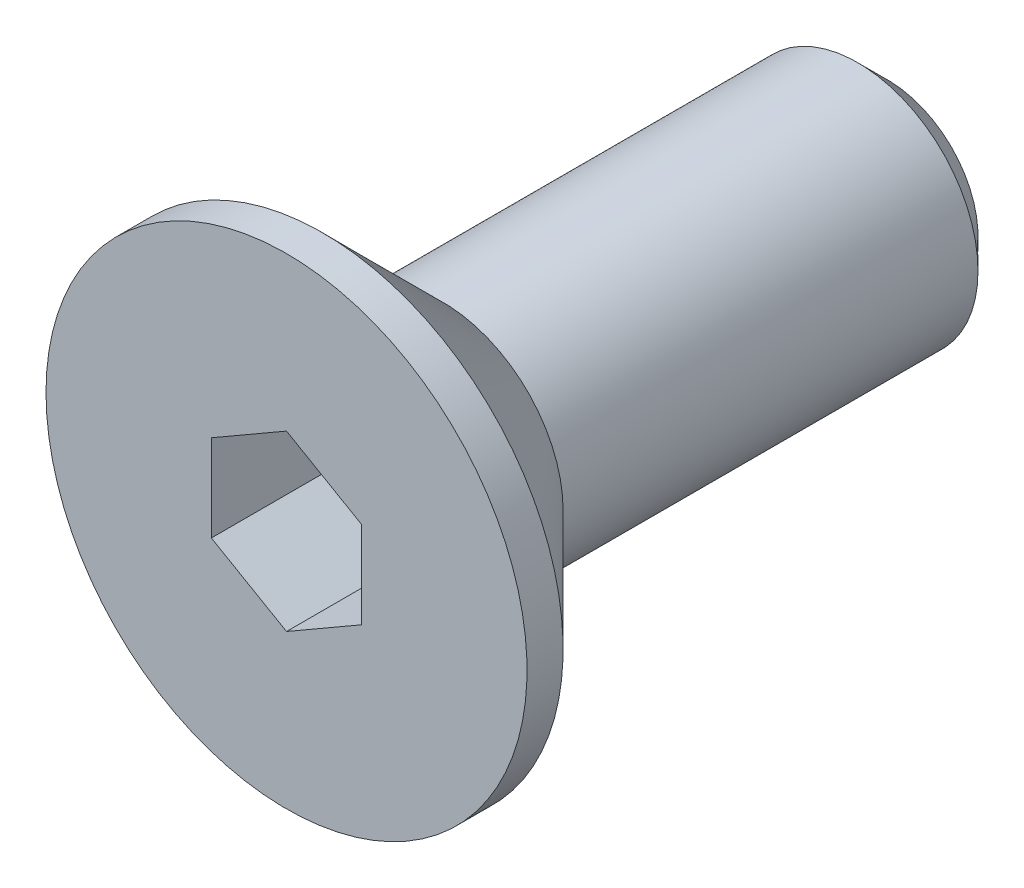
ISO-10303-21;
HEADER;
FILE_DESCRIPTION(('STEP AP214'),'2;1');
FILE_NAME('part.step','',(''),(''),'','','');
FILE_SCHEMA(('AUTOMOTIVE_DESIGN { 1 0 10303 214 1 1 1 1 }'));
ENDSEC;
DATA;
#1=APPLICATION_CONTEXT('core data for automotive mechanical design processes');
#2=APPLICATION_PROTOCOL_DEFINITION('international standard','automotive_design',2000,#1);
#3=PRODUCT_CONTEXT('',#1,'mechanical');
#4=PRODUCT('Part','Part','',(#3));
#5=PRODUCT_RELATED_PRODUCT_CATEGORY('part','',(#4));
#6=PRODUCT_DEFINITION_FORMATION('','',#4);
#7=PRODUCT_DEFINITION_CONTEXT('part definition',#1,'design');
#8=PRODUCT_DEFINITION('design','',#6,#7);
#9=PRODUCT_DEFINITION_SHAPE('','',#8);
#10=(LENGTH_UNIT() NAMED_UNIT(*) SI_UNIT(.MILLI.,.METRE.));
#11=(NAMED_UNIT(*) PLANE_ANGLE_UNIT() SI_UNIT($,.RADIAN.));
#12=(NAMED_UNIT(*) SI_UNIT($,.STERADIAN.) SOLID_ANGLE_UNIT());
#13=UNCERTAINTY_MEASURE_WITH_UNIT(LENGTH_MEASURE(1.E-05),#10,'distance_accuracy_value','');
#14=(GEOMETRIC_REPRESENTATION_CONTEXT(3) GLOBAL_UNCERTAINTY_ASSIGNED_CONTEXT((#13)) GLOBAL_UNIT_ASSIGNED_CONTEXT((#10,
#11,#12)) REPRESENTATION_CONTEXT('',''));
#15=CARTESIAN_POINT('',(0.,0.,0.));
#16=DIRECTION('',(0.,0.,1.));
#17=DIRECTION('',(1.,0.,0.));
#18=AXIS2_PLACEMENT_3D('',#15,#16,#17);
#19=CARTESIAN_POINT('',(0.,0.,5.));
#20=DIRECTION('',(0.,0.,1.));
#21=DIRECTION('',(1.,0.,0.));
#22=AXIS2_PLACEMENT_3D('',#19,#20,#21);
#23=PLANE('',#22);
#24=DIRECTION('',(-0.866025403784439,0.5,0.));
#25=VECTOR('',#24,1.);
#26=CARTESIAN_POINT('',(1.25,0.721687836487034,5.));
#27=LINE('',#26,#25);
#28=CARTESIAN_POINT('',(1.25,0.721687836487034,5.));
#29=VERTEX_POINT('',#28);
#30=CARTESIAN_POINT('',(0.,1.44337567297407,5.));
#31=VERTEX_POINT('',#30);
#32=EDGE_CURVE('E67',#29,#31,#27,.T.);
#33=ORIENTED_EDGE('',*,*,#32,.F.);
#34=DIRECTION('',(0.,1.,0.));
#35=VECTOR('',#34,1.);
#36=CARTESIAN_POINT('',(1.25,-0.721687836487031,5.));
#37=LINE('',#36,#35);
#38=CARTESIAN_POINT('',(1.25,-0.721687836487031,5.));
#39=VERTEX_POINT('',#38);
#40=EDGE_CURVE('E150',#39,#29,#37,.T.);
#41=ORIENTED_EDGE('',*,*,#40,.F.);
#42=DIRECTION('',(0.866025403784439,0.5,0.));
#43=VECTOR('',#42,1.);
#44=CARTESIAN_POINT('',(0.,-1.44337567297406,5.));
#45=LINE('',#44,#43);
#46=CARTESIAN_POINT('',(0.,-1.44337567297406,5.));
#47=VERTEX_POINT('',#46);
#48=EDGE_CURVE('E148',#47,#39,#45,.T.);
#49=ORIENTED_EDGE('',*,*,#48,.F.);
#50=DIRECTION('',(0.866025403784439,-0.5,0.));
#51=VECTOR('',#50,1.);
#52=CARTESIAN_POINT('',(-1.25,-0.721687836487031,5.));
#53=LINE('',#52,#51);
#54=CARTESIAN_POINT('',(-1.25,-0.721687836487031,5.));
#55=VERTEX_POINT('',#54);
#56=EDGE_CURVE('E115',#55,#47,#53,.T.);
#57=ORIENTED_EDGE('',*,*,#56,.F.);
#58=DIRECTION('',(0.,-1.,0.));
#59=VECTOR('',#58,1.);
#60=CARTESIAN_POINT('',(-1.25,0.721687836487034,5.));
#61=LINE('',#60,#59);
#62=CARTESIAN_POINT('',(-1.25,0.721687836487034,5.));
#63=VERTEX_POINT('',#62);
#64=EDGE_CURVE('E144',#63,#55,#61,.T.);
#65=ORIENTED_EDGE('',*,*,#64,.F.);
#66=DIRECTION('',(-0.866025403784439,-0.5,0.));
#67=VECTOR('',#66,1.);
#68=CARTESIAN_POINT('',(0.,1.44337567297407,5.));
#69=LINE('',#68,#67);
#70=EDGE_CURVE('E141',#31,#63,#69,.T.);
#71=ORIENTED_EDGE('',*,*,#70,.F.);
#72=EDGE_LOOP('',(#33,#41,#49,#57,#65,#71));
#73=FACE_BOUND('',#72,.T.);
#74=CARTESIAN_POINT('',(0.,0.,5.));
#75=DIRECTION('',(0.,0.,-1.));
#76=DIRECTION('',(-1.,0.,0.));
#77=AXIS2_PLACEMENT_3D('',#74,#75,#76);
#78=CIRCLE('',#77,4.);
#79=CARTESIAN_POINT('',(-4.,0.,5.));
#80=VERTEX_POINT('',#79);
#81=EDGE_CURVE('E165',#80,#80,#78,.T.);
#82=ORIENTED_EDGE('',*,*,#81,.F.);
#83=EDGE_LOOP('',(#82));
#84=FACE_BOUND('',#83,.T.);
#85=ADVANCED_FACE('F51',(#73,#84),#23,.T.);
#86=CARTESIAN_POINT('',(0.,0.,-5.));
#87=DIRECTION('',(0.,0.,-1.));
#88=DIRECTION('',(-1.,0.,0.));
#89=AXIS2_PLACEMENT_3D('',#86,#87,#88);
#90=CYLINDRICAL_SURFACE('',#89,4.);
#91=ORIENTED_EDGE('',*,*,#81,.T.);
#92=EDGE_LOOP('',(#91));
#93=FACE_BOUND('',#92,.T.);
#94=CARTESIAN_POINT('',(0.,0.,4.39999999999999));
#95=DIRECTION('',(0.,0.,-1.));
#96=DIRECTION('',(-1.,0.,0.));
#97=AXIS2_PLACEMENT_3D('',#94,#95,#96);
#98=CIRCLE('',#97,4.);
#99=CARTESIAN_POINT('',(-4.,0.,4.39999999999999));
#100=VERTEX_POINT('',#99);
#101=EDGE_CURVE('E162',#100,#100,#98,.T.);
#102=ORIENTED_EDGE('',*,*,#101,.F.);
#103=EDGE_LOOP('',(#102));
#104=FACE_BOUND('',#103,.T.);
#105=ADVANCED_FACE('F185',(#93,#104),#90,.T.);
#106=CARTESIAN_POINT('',(0.,0.,2.4));
#107=DIRECTION('',(0.,0.,1.));
#108=DIRECTION('',(1.,0.,0.));
#109=AXIS2_PLACEMENT_3D('',#106,#107,#108);
#110=CONICAL_SURFACE('',#109,2.,0.78539816339745);
#111=ORIENTED_EDGE('',*,*,#101,.T.);
#112=EDGE_LOOP('',(#111));
#113=FACE_BOUND('',#112,.T.);
#114=CARTESIAN_POINT('',(0.,0.,2.4));
#115=DIRECTION('',(0.,0.,-1.));
#116=DIRECTION('',(-1.,0.,0.));
#117=AXIS2_PLACEMENT_3D('',#114,#115,#116);
#118=CIRCLE('',#117,2.);
#119=CARTESIAN_POINT('',(-2.,0.,2.4));
#120=VERTEX_POINT('',#119);
#121=EDGE_CURVE('E154',#120,#120,#118,.T.);
#122=ORIENTED_EDGE('',*,*,#121,.F.);
#123=EDGE_LOOP('',(#122));
#124=FACE_BOUND('',#123,.T.);
#125=ADVANCED_FACE('F190',(#113,#124),#110,.T.);
#126=CARTESIAN_POINT('',(0.,0.,-5.));
#127=DIRECTION('',(0.,0.,-1.));
#128=DIRECTION('',(-1.,0.,0.));
#129=AXIS2_PLACEMENT_3D('',#126,#127,#128);
#130=CYLINDRICAL_SURFACE('',#129,2.);
#131=CARTESIAN_POINT('',(0.,0.,-4.5));
#132=DIRECTION('',(0.,0.,-1.));
#133=DIRECTION('',(-1.,0.,0.));
#134=AXIS2_PLACEMENT_3D('',#131,#132,#133);
#135=CIRCLE('',#134,2.);
#136=CARTESIAN_POINT('',(-2.,0.,-4.5));
#137=VERTEX_POINT('',#136);
#138=EDGE_CURVE('E13',#137,#137,#135,.F.);
#139=ORIENTED_EDGE('',*,*,#138,.T.);
#140=EDGE_LOOP('',(#139));
#141=FACE_BOUND('',#140,.T.);
#142=ORIENTED_EDGE('',*,*,#121,.T.);
#143=EDGE_LOOP('',(#142));
#144=FACE_BOUND('',#143,.T.);
#145=ADVANCED_FACE('F181',(#141,#144),#130,.T.);
#146=CARTESIAN_POINT('',(0.,2.,-5.));
#147=DIRECTION('',(0.,0.,-1.));
#148=DIRECTION('',(-1.,0.,0.));
#149=AXIS2_PLACEMENT_3D('',#146,#147,#148);
#150=PLANE('',#149);
#151=CARTESIAN_POINT('',(0.,0.,-5.));
#152=DIRECTION('',(0.,0.,-1.));
#153=DIRECTION('',(-1.,0.,0.));
#154=AXIS2_PLACEMENT_3D('',#151,#152,#153);
#155=CIRCLE('',#154,1.5);
#156=CARTESIAN_POINT('',(-1.5,0.,-5.));
#157=VERTEX_POINT('',#156);
#158=EDGE_CURVE('E60',#157,#157,#155,.T.);
#159=ORIENTED_EDGE('',*,*,#158,.T.);
#160=EDGE_LOOP('',(#159));
#161=FACE_BOUND('',#160,.T.);
#162=ADVANCED_FACE('F170',(#161),#150,.T.);
#163=CARTESIAN_POINT('',(0.,0.,-5.));
#164=DIRECTION('',(0.,0.,1.));
#165=DIRECTION('',(1.,0.,0.));
#166=AXIS2_PLACEMENT_3D('',#163,#164,#165);
#167=CONICAL_SURFACE('',#166,1.5,0.785398163397447);
#168=ORIENTED_EDGE('',*,*,#138,.F.);
#169=EDGE_LOOP('',(#168));
#170=FACE_BOUND('',#169,.T.);
#171=ORIENTED_EDGE('',*,*,#158,.F.);
#172=EDGE_LOOP('',(#171));
#173=FACE_BOUND('',#172,.T.);
#174=ADVANCED_FACE('F54',(#170,#173),#167,.T.);
#175=CARTESIAN_POINT('',(1.25,0.721687836487034,2.5));
#176=DIRECTION('',(0.5,0.866025403784439,0.));
#177=DIRECTION('',(-0.866025403784439,0.5,0.));
#178=AXIS2_PLACEMENT_3D('',#175,#176,#177);
#179=PLANE('',#178);
#180=ORIENTED_EDGE('',*,*,#32,.T.);
#181=DIRECTION('',(0.,0.,1.));
#182=VECTOR('',#181,1.);
#183=CARTESIAN_POINT('',(0.,1.44337567297407,2.5));
#184=LINE('',#183,#182);
#185=CARTESIAN_POINT('',(0.,1.44337567297407,2.5));
#186=VERTEX_POINT('',#185);
#187=EDGE_CURVE('E97',#186,#31,#184,.T.);
#188=ORIENTED_EDGE('',*,*,#187,.F.);
#189=DIRECTION('',(-0.866025403784439,0.5,0.));
#190=VECTOR('',#189,1.);
#191=CARTESIAN_POINT('',(1.25,0.721687836487034,2.5));
#192=LINE('',#191,#190);
#193=CARTESIAN_POINT('',(1.25,0.721687836487034,2.5));
#194=VERTEX_POINT('',#193);
#195=EDGE_CURVE('E152',#194,#186,#192,.T.);
#196=ORIENTED_EDGE('',*,*,#195,.F.);
#197=DIRECTION('',(0.,0.,1.));
#198=VECTOR('',#197,1.);
#199=CARTESIAN_POINT('',(1.25,0.721687836487034,2.5));
#200=LINE('',#199,#198);
#201=EDGE_CURVE('E75',#194,#29,#200,.T.);
#202=ORIENTED_EDGE('',*,*,#201,.T.);
#203=EDGE_LOOP('',(#180,#188,#196,#202));
#204=FACE_BOUND('',#203,.T.);
#205=ADVANCED_FACE('F173',(#204),#179,.F.);
#206=CARTESIAN_POINT('',(1.25,-0.721687836487031,2.5));
#207=DIRECTION('',(1.,0.,0.));
#208=DIRECTION('',(0.,1.,0.));
#209=AXIS2_PLACEMENT_3D('',#206,#207,#208);
#210=PLANE('',#209);
#211=ORIENTED_EDGE('',*,*,#40,.T.);
#212=ORIENTED_EDGE('',*,*,#201,.F.);
#213=DIRECTION('',(0.,1.,0.));
#214=VECTOR('',#213,1.);
#215=CARTESIAN_POINT('',(1.25,-0.721687836487031,2.5));
#216=LINE('',#215,#214);
#217=CARTESIAN_POINT('',(1.25,-0.721687836487031,2.5));
#218=VERTEX_POINT('',#217);
#219=EDGE_CURVE('E127',#218,#194,#216,.T.);
#220=ORIENTED_EDGE('',*,*,#219,.F.);
#221=DIRECTION('',(0.,0.,1.));
#222=VECTOR('',#221,1.);
#223=CARTESIAN_POINT('',(1.25,-0.721687836487031,2.5));
#224=LINE('',#223,#222);
#225=EDGE_CURVE('E119',#218,#39,#224,.T.);
#226=ORIENTED_EDGE('',*,*,#225,.T.);
#227=EDGE_LOOP('',(#211,#212,#220,#226));
#228=FACE_BOUND('',#227,.T.);
#229=ADVANCED_FACE('F179',(#228),#210,.F.);
#230=CARTESIAN_POINT('',(0.,-1.44337567297406,2.5));
#231=DIRECTION('',(0.5,-0.866025403784439,0.));
#232=DIRECTION('',(0.866025403784439,0.5,0.));
#233=AXIS2_PLACEMENT_3D('',#230,#231,#232);
#234=PLANE('',#233);
#235=ORIENTED_EDGE('',*,*,#48,.T.);
#236=ORIENTED_EDGE('',*,*,#225,.F.);
#237=DIRECTION('',(0.866025403784439,0.5,0.));
#238=VECTOR('',#237,1.);
#239=CARTESIAN_POINT('',(0.,-1.44337567297406,2.5));
#240=LINE('',#239,#238);
#241=CARTESIAN_POINT('',(0.,-1.44337567297406,2.5));
#242=VERTEX_POINT('',#241);
#243=EDGE_CURVE('E123',#242,#218,#240,.T.);
#244=ORIENTED_EDGE('',*,*,#243,.F.);
#245=DIRECTION('',(0.,0.,1.));
#246=VECTOR('',#245,1.);
#247=CARTESIAN_POINT('',(0.,-1.44337567297406,2.5));
#248=LINE('',#247,#246);
#249=EDGE_CURVE('E108',#242,#47,#248,.T.);
#250=ORIENTED_EDGE('',*,*,#249,.T.);
#251=EDGE_LOOP('',(#235,#236,#244,#250));
#252=FACE_BOUND('',#251,.T.);
#253=ADVANCED_FACE('F124',(#252),#234,.F.);
#254=CARTESIAN_POINT('',(-1.25,-0.721687836487031,2.5));
#255=DIRECTION('',(-0.5,-0.866025403784438,0.));
#256=DIRECTION('',(0.866025403784439,-0.5,0.));
#257=AXIS2_PLACEMENT_3D('',#254,#255,#256);
#258=PLANE('',#257);
#259=ORIENTED_EDGE('',*,*,#56,.T.);
#260=ORIENTED_EDGE('',*,*,#249,.F.);
#261=DIRECTION('',(0.866025403784439,-0.5,0.));
#262=VECTOR('',#261,1.);
#263=CARTESIAN_POINT('',(-1.25,-0.721687836487031,2.5));
#264=LINE('',#263,#262);
#265=CARTESIAN_POINT('',(-1.25,-0.721687836487031,2.5));
#266=VERTEX_POINT('',#265);
#267=EDGE_CURVE('E112',#266,#242,#264,.T.);
#268=ORIENTED_EDGE('',*,*,#267,.F.);
#269=DIRECTION('',(0.,0.,1.));
#270=VECTOR('',#269,1.);
#271=CARTESIAN_POINT('',(-1.25,-0.721687836487031,2.5));
#272=LINE('',#271,#270);
#273=EDGE_CURVE('E120',#266,#55,#272,.T.);
#274=ORIENTED_EDGE('',*,*,#273,.T.);
#275=EDGE_LOOP('',(#259,#260,#268,#274));
#276=FACE_BOUND('',#275,.T.);
#277=ADVANCED_FACE('F110',(#276),#258,.F.);
#278=CARTESIAN_POINT('',(-1.25,0.721687836487034,2.5));
#279=DIRECTION('',(-1.,0.,0.));
#280=DIRECTION('',(0.,0.,1.));
#281=AXIS2_PLACEMENT_3D('',#278,#279,#280);
#282=PLANE('',#281);
#283=ORIENTED_EDGE('',*,*,#64,.T.);
#284=ORIENTED_EDGE('',*,*,#273,.F.);
#285=DIRECTION('',(0.,-1.,0.));
#286=VECTOR('',#285,1.);
#287=CARTESIAN_POINT('',(-1.25,0.721687836487034,2.5));
#288=LINE('',#287,#286);
#289=CARTESIAN_POINT('',(-1.25,0.721687836487034,2.5));
#290=VERTEX_POINT('',#289);
#291=EDGE_CURVE('E133',#290,#266,#288,.T.);
#292=ORIENTED_EDGE('',*,*,#291,.F.);
#293=DIRECTION('',(0.,0.,1.));
#294=VECTOR('',#293,1.);
#295=CARTESIAN_POINT('',(-1.25,0.721687836487034,2.5));
#296=LINE('',#295,#294);
#297=EDGE_CURVE('E157',#290,#63,#296,.T.);
#298=ORIENTED_EDGE('',*,*,#297,.T.);
#299=EDGE_LOOP('',(#283,#284,#292,#298));
#300=FACE_BOUND('',#299,.T.);
#301=ADVANCED_FACE('F204',(#300),#282,.F.);
#302=CARTESIAN_POINT('',(0.,1.44337567297407,2.5));
#303=DIRECTION('',(-0.5,0.866025403784439,0.));
#304=DIRECTION('',(-0.866025403784439,-0.5,0.));
#305=AXIS2_PLACEMENT_3D('',#302,#303,#304);
#306=PLANE('',#305);
#307=ORIENTED_EDGE('',*,*,#70,.T.);
#308=ORIENTED_EDGE('',*,*,#297,.F.);
#309=DIRECTION('',(-0.866025403784439,-0.5,0.));
#310=VECTOR('',#309,1.);
#311=CARTESIAN_POINT('',(0.,1.44337567297407,2.5));
#312=LINE('',#311,#310);
#313=EDGE_CURVE('E135',#186,#290,#312,.T.);
#314=ORIENTED_EDGE('',*,*,#313,.F.);
#315=ORIENTED_EDGE('',*,*,#187,.T.);
#316=EDGE_LOOP('',(#307,#308,#314,#315));
#317=FACE_BOUND('',#316,.T.);
#318=ADVANCED_FACE('F201',(#317),#306,.F.);
#319=CARTESIAN_POINT('',(0.,0.,2.5));
#320=DIRECTION('',(0.,0.,1.));
#321=DIRECTION('',(1.,0.,0.));
#322=AXIS2_PLACEMENT_3D('',#319,#320,#321);
#323=PLANE('',#322);
#324=ORIENTED_EDGE('',*,*,#195,.T.);
#325=ORIENTED_EDGE('',*,*,#313,.T.);
#326=ORIENTED_EDGE('',*,*,#291,.T.);
#327=ORIENTED_EDGE('',*,*,#267,.T.);
#328=ORIENTED_EDGE('',*,*,#243,.T.);
#329=ORIENTED_EDGE('',*,*,#219,.T.);
#330=EDGE_LOOP('',(#324,#325,#326,#327,#328,#329));
#331=FACE_BOUND('',#330,.T.);
#332=ADVANCED_FACE('F130',(#331),#323,.T.);
#333=CLOSED_SHELL('',(#85,#105,#125,#145,#162,#174,#205,#229,#253,#277,#301,#318,#332));
#334=MANIFOLD_SOLID_BREP('B2',#333);
#335=ADVANCED_BREP_SHAPE_REPRESENTATION('',(#18,#334),#14);
#336=SHAPE_DEFINITION_REPRESENTATION(#9,#335);
ENDSEC;
END-ISO-10303-21;
